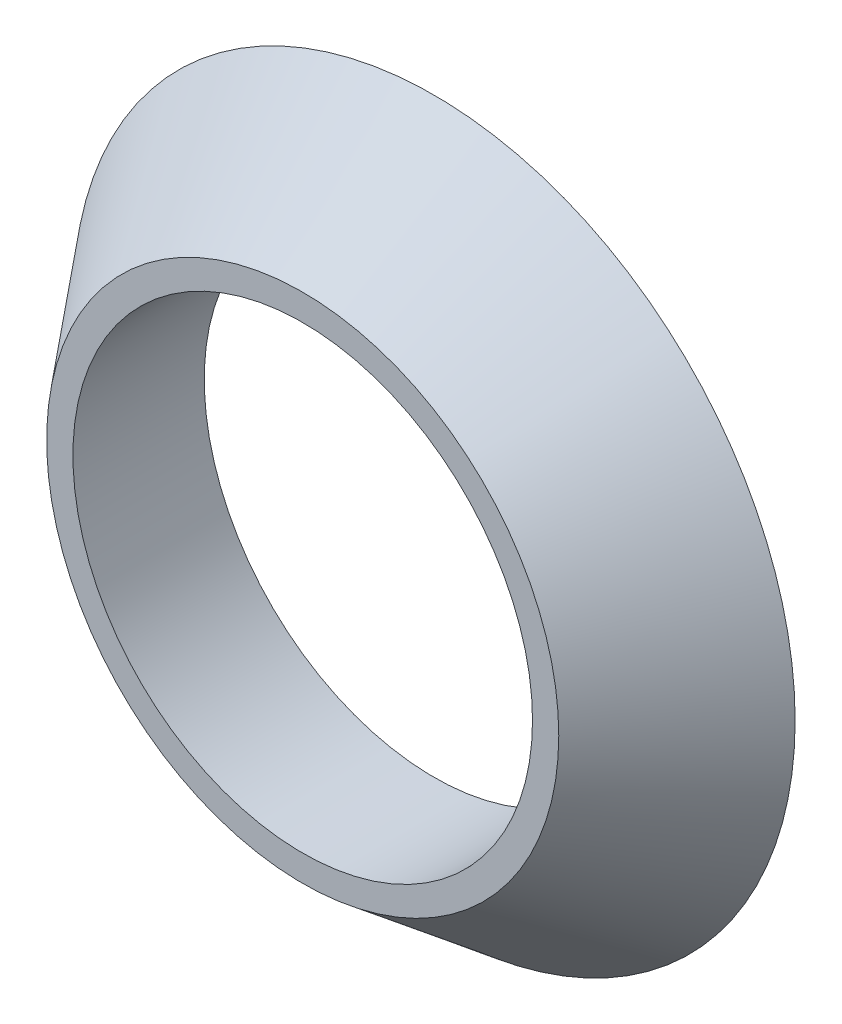
ISO-10303-21;
HEADER;
FILE_DESCRIPTION(('STEP AP214'),'2;1');
FILE_NAME('part.step','',(''),(''),'','','');
FILE_SCHEMA(('AUTOMOTIVE_DESIGN { 1 0 10303 214 1 1 1 1 }'));
ENDSEC;
DATA;
#1=APPLICATION_CONTEXT('core data for automotive mechanical design processes');
#2=APPLICATION_PROTOCOL_DEFINITION('international standard','automotive_design',2000,#1);
#3=PRODUCT_CONTEXT('',#1,'mechanical');
#4=PRODUCT('Part','Part','',(#3));
#5=PRODUCT_RELATED_PRODUCT_CATEGORY('part','',(#4));
#6=PRODUCT_DEFINITION_FORMATION('','',#4);
#7=PRODUCT_DEFINITION_CONTEXT('part definition',#1,'design');
#8=PRODUCT_DEFINITION('design','',#6,#7);
#9=PRODUCT_DEFINITION_SHAPE('','',#8);
#10=(LENGTH_UNIT() NAMED_UNIT(*) SI_UNIT(.MILLI.,.METRE.));
#11=(NAMED_UNIT(*) PLANE_ANGLE_UNIT() SI_UNIT($,.RADIAN.));
#12=(NAMED_UNIT(*) SI_UNIT($,.STERADIAN.) SOLID_ANGLE_UNIT());
#13=UNCERTAINTY_MEASURE_WITH_UNIT(LENGTH_MEASURE(1.E-05),#10,'distance_accuracy_value','');
#14=(GEOMETRIC_REPRESENTATION_CONTEXT(3) GLOBAL_UNCERTAINTY_ASSIGNED_CONTEXT((#13)) GLOBAL_UNIT_ASSIGNED_CONTEXT((#10,
#11,#12)) REPRESENTATION_CONTEXT('',''));
#15=CARTESIAN_POINT('',(0.,0.,0.));
#16=DIRECTION('',(0.,0.,1.));
#17=DIRECTION('',(1.,0.,0.));
#18=AXIS2_PLACEMENT_3D('',#15,#16,#17);
#19=CARTESIAN_POINT('',(0.,24.765,-26.1275228401997));
#20=DIRECTION('',(0.,0.,-1.));
#21=DIRECTION('',(-1.,0.,0.));
#22=AXIS2_PLACEMENT_3D('',#19,#20,#21);
#23=PLANE('',#22);
#24=CARTESIAN_POINT('',(0.,0.,-26.1275228401997));
#25=DIRECTION('',(0.,0.,1.));
#26=DIRECTION('',(1.,0.,0.));
#27=AXIS2_PLACEMENT_3D('',#24,#25,#26);
#28=CIRCLE('',#27,22.225);
#29=CARTESIAN_POINT('',(22.225,0.,-26.1275228401997));
#30=VERTEX_POINT('',#29);
#31=EDGE_CURVE('E10',#30,#30,#28,.T.);
#32=ORIENTED_EDGE('',*,*,#31,.F.);
#33=EDGE_LOOP('',(#32));
#34=FACE_BOUND('',#33,.T.);
#35=CARTESIAN_POINT('',(0.,0.,-26.1275228401997));
#36=DIRECTION('',(0.,0.,1.));
#37=DIRECTION('',(1.,0.,0.));
#38=AXIS2_PLACEMENT_3D('',#35,#36,#37);
#39=CIRCLE('',#38,24.765);
#40=CARTESIAN_POINT('',(24.765,0.,-26.1275228401997));
#41=VERTEX_POINT('',#40);
#42=EDGE_CURVE('E54',#41,#41,#39,.T.);
#43=ORIENTED_EDGE('',*,*,#42,.T.);
#44=EDGE_LOOP('',(#43));
#45=FACE_BOUND('',#44,.T.);
#46=ADVANCED_FACE('F37',(#34,#45),#23,.F.);
#47=CARTESIAN_POINT('',(0.,0.,0.));
#48=DIRECTION('',(0.,0.,1.));
#49=DIRECTION('',(1.,0.,0.));
#50=AXIS2_PLACEMENT_3D('',#47,#48,#49);
#51=CYLINDRICAL_SURFACE('',#50,22.225);
#52=CARTESIAN_POINT('',(0.,0.,-38.8275228401997));
#53=DIRECTION('',(0.,0.,1.));
#54=DIRECTION('',(1.,0.,0.));
#55=AXIS2_PLACEMENT_3D('',#52,#53,#54);
#56=CIRCLE('',#55,22.225);
#57=CARTESIAN_POINT('',(22.225,0.,-38.8275228401997));
#58=VERTEX_POINT('',#57);
#59=EDGE_CURVE('E44',#58,#58,#56,.T.);
#60=ORIENTED_EDGE('',*,*,#59,.F.);
#61=EDGE_LOOP('',(#60));
#62=FACE_BOUND('',#61,.T.);
#63=ORIENTED_EDGE('',*,*,#31,.T.);
#64=EDGE_LOOP('',(#63));
#65=FACE_BOUND('',#64,.T.);
#66=ADVANCED_FACE('F70',(#62,#65),#51,.F.);
#67=CARTESIAN_POINT('',(0.,22.225,-38.8275228401997));
#68=DIRECTION('',(0.,0.,1.));
#69=DIRECTION('',(1.,0.,0.));
#70=AXIS2_PLACEMENT_3D('',#67,#68,#69);
#71=PLANE('',#70);
#72=CARTESIAN_POINT('',(0.,0.,-38.8275228401997));
#73=DIRECTION('',(0.,0.,1.));
#74=DIRECTION('',(1.,0.,0.));
#75=AXIS2_PLACEMENT_3D('',#72,#73,#74);
#76=CIRCLE('',#75,34.925);
#77=CARTESIAN_POINT('',(34.925,0.,-38.8275228401997));
#78=VERTEX_POINT('',#77);
#79=EDGE_CURVE('E49',#78,#78,#76,.T.);
#80=ORIENTED_EDGE('',*,*,#79,.F.);
#81=EDGE_LOOP('',(#80));
#82=FACE_BOUND('',#81,.T.);
#83=ORIENTED_EDGE('',*,*,#59,.T.);
#84=EDGE_LOOP('',(#83));
#85=FACE_BOUND('',#84,.T.);
#86=ADVANCED_FACE('F65',(#82,#85),#71,.F.);
#87=CARTESIAN_POINT('',(0.,0.,-38.8275228401997));
#88=DIRECTION('',(0.,0.,-1.));
#89=DIRECTION('',(-1.,0.,0.));
#90=AXIS2_PLACEMENT_3D('',#87,#88,#89);
#91=CONICAL_SURFACE('',#90,34.925,0.674740942223553);
#92=ORIENTED_EDGE('',*,*,#42,.F.);
#93=EDGE_LOOP('',(#92));
#94=FACE_BOUND('',#93,.T.);
#95=ORIENTED_EDGE('',*,*,#79,.T.);
#96=EDGE_LOOP('',(#95));
#97=FACE_BOUND('',#96,.T.);
#98=ADVANCED_FACE('F62',(#94,#97),#91,.T.);
#99=CLOSED_SHELL('',(#46,#66,#86,#98));
#100=MANIFOLD_SOLID_BREP('B2',#99);
#101=ADVANCED_BREP_SHAPE_REPRESENTATION('',(#18,#100),#14);
#102=SHAPE_DEFINITION_REPRESENTATION(#9,#101);
ENDSEC;
END-ISO-10303-21;
